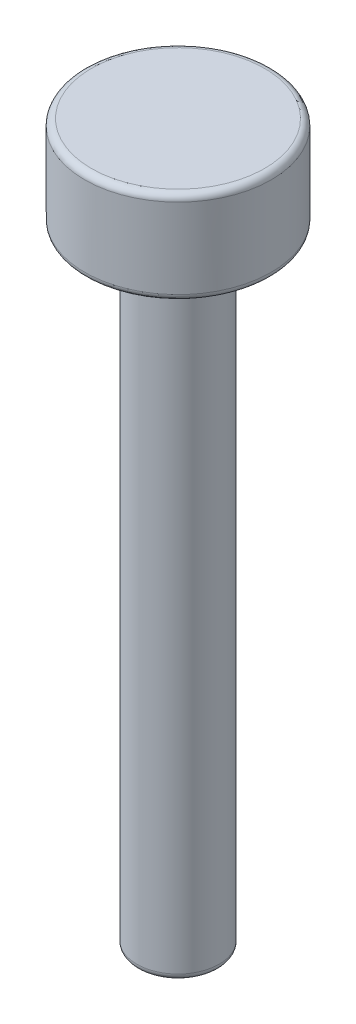
ISO-10303-21;
HEADER;
FILE_DESCRIPTION(('STEP AP214'),'2;1');
FILE_NAME('part.step','',(''),(''),'','','');
FILE_SCHEMA(('AUTOMOTIVE_DESIGN { 1 0 10303 214 1 1 1 1 }'));
ENDSEC;
DATA;
#1=APPLICATION_CONTEXT('core data for automotive mechanical design processes');
#2=APPLICATION_PROTOCOL_DEFINITION('international standard','automotive_design',2000,#1);
#3=PRODUCT_CONTEXT('',#1,'mechanical');
#4=PRODUCT('Part','Part','',(#3));
#5=PRODUCT_RELATED_PRODUCT_CATEGORY('part','',(#4));
#6=PRODUCT_DEFINITION_FORMATION('','',#4);
#7=PRODUCT_DEFINITION_CONTEXT('part definition',#1,'design');
#8=PRODUCT_DEFINITION('design','',#6,#7);
#9=PRODUCT_DEFINITION_SHAPE('','',#8);
#10=(LENGTH_UNIT() NAMED_UNIT(*) SI_UNIT(.MILLI.,.METRE.));
#11=(NAMED_UNIT(*) PLANE_ANGLE_UNIT() SI_UNIT($,.RADIAN.));
#12=(NAMED_UNIT(*) SI_UNIT($,.STERADIAN.) SOLID_ANGLE_UNIT());
#13=UNCERTAINTY_MEASURE_WITH_UNIT(LENGTH_MEASURE(1.E-05),#10,'distance_accuracy_value','');
#14=(GEOMETRIC_REPRESENTATION_CONTEXT(3) GLOBAL_UNCERTAINTY_ASSIGNED_CONTEXT((#13)) GLOBAL_UNIT_ASSIGNED_CONTEXT((#10,
#11,#12)) REPRESENTATION_CONTEXT('',''));
#15=CARTESIAN_POINT('',(0.,0.,0.));
#16=DIRECTION('',(0.,0.,1.));
#17=DIRECTION('',(1.,0.,0.));
#18=AXIS2_PLACEMENT_3D('',#15,#16,#17);
#19=CARTESIAN_POINT('',(0.,0.,0.));
#20=DIRECTION('',(0.,-1.,0.));
#21=DIRECTION('',(0.,0.,-1.));
#22=AXIS2_PLACEMENT_3D('',#19,#20,#21);
#23=PLANE('',#22);
#24=CARTESIAN_POINT('',(0.,0.,0.));
#25=DIRECTION('',(0.,-1.,0.));
#26=DIRECTION('',(0.,0.,-1.));
#27=AXIS2_PLACEMENT_3D('',#24,#25,#26);
#28=CIRCLE('',#27,4.0005);
#29=CARTESIAN_POINT('',(0.,0.,-4.0005));
#30=VERTEX_POINT('',#29);
#31=EDGE_CURVE('E49',#30,#30,#28,.T.);
#32=ORIENTED_EDGE('',*,*,#31,.T.);
#33=EDGE_LOOP('',(#32));
#34=FACE_BOUND('',#33,.T.);
#35=ADVANCED_FACE('F41',(#34),#23,.T.);
#36=CARTESIAN_POINT('',(0.,0.,0.));
#37=DIRECTION('',(0.,-1.,0.));
#38=DIRECTION('',(0.,0.,-1.));
#39=AXIS2_PLACEMENT_3D('',#36,#37,#38);
#40=CYLINDRICAL_SURFACE('',#39,4.7625);
#41=CARTESIAN_POINT('',(0.,0.762,0.));
#42=DIRECTION('',(0.,-1.,0.));
#43=DIRECTION('',(0.,0.,-1.));
#44=AXIS2_PLACEMENT_3D('',#41,#42,#43);
#45=CIRCLE('',#44,4.7625);
#46=CARTESIAN_POINT('',(0.,0.762,-4.7625));
#47=VERTEX_POINT('',#46);
#48=EDGE_CURVE('E10',#47,#47,#45,.F.);
#49=ORIENTED_EDGE('',*,*,#48,.T.);
#50=EDGE_LOOP('',(#49));
#51=FACE_BOUND('',#50,.T.);
#52=CARTESIAN_POINT('',(0.,72.39,0.));
#53=DIRECTION('',(0.,-1.,0.));
#54=DIRECTION('',(0.,0.,-1.));
#55=AXIS2_PLACEMENT_3D('',#52,#53,#54);
#56=CIRCLE('',#55,4.7625);
#57=CARTESIAN_POINT('',(0.,72.39,-4.7625));
#58=VERTEX_POINT('',#57);
#59=EDGE_CURVE('E73',#58,#58,#56,.T.);
#60=ORIENTED_EDGE('',*,*,#59,.T.);
#61=EDGE_LOOP('',(#60));
#62=FACE_BOUND('',#61,.T.);
#63=ADVANCED_FACE('F78',(#51,#62),#40,.T.);
#64=CARTESIAN_POINT('',(4.7625,72.39,0.));
#65=DIRECTION('',(0.,-1.,0.));
#66=DIRECTION('',(0.,0.,-1.));
#67=AXIS2_PLACEMENT_3D('',#64,#65,#66);
#68=PLANE('',#67);
#69=CARTESIAN_POINT('',(0.,72.39,0.));
#70=DIRECTION('',(0.,-1.,0.));
#71=DIRECTION('',(0.,0.,-1.));
#72=AXIS2_PLACEMENT_3D('',#69,#70,#71);
#73=CIRCLE('',#72,10.033);
#74=CARTESIAN_POINT('',(0.,72.39,-10.033));
#75=VERTEX_POINT('',#74);
#76=EDGE_CURVE('E69',#75,#75,#73,.T.);
#77=ORIENTED_EDGE('',*,*,#76,.T.);
#78=EDGE_LOOP('',(#77));
#79=FACE_BOUND('',#78,.T.);
#80=ORIENTED_EDGE('',*,*,#59,.F.);
#81=EDGE_LOOP('',(#80));
#82=FACE_BOUND('',#81,.T.);
#83=ADVANCED_FACE('F80',(#79,#82),#68,.T.);
#84=CARTESIAN_POINT('',(0.,0.,0.));
#85=DIRECTION('',(0.,-1.,0.));
#86=DIRECTION('',(0.,0.,-1.));
#87=AXIS2_PLACEMENT_3D('',#84,#85,#86);
#88=CYLINDRICAL_SURFACE('',#87,10.795);
#89=CARTESIAN_POINT('',(0.,73.152,0.));
#90=DIRECTION('',(0.,-1.,0.));
#91=DIRECTION('',(0.,0.,-1.));
#92=AXIS2_PLACEMENT_3D('',#89,#90,#91);
#93=CIRCLE('',#92,10.795);
#94=CARTESIAN_POINT('',(0.,73.152,-10.795));
#95=VERTEX_POINT('',#94);
#96=EDGE_CURVE('E59',#95,#95,#93,.F.);
#97=ORIENTED_EDGE('',*,*,#96,.T.);
#98=EDGE_LOOP('',(#97));
#99=FACE_BOUND('',#98,.T.);
#100=CARTESIAN_POINT('',(0.,82.423,0.));
#101=DIRECTION('',(0.,1.,0.));
#102=DIRECTION('',(0.,0.,1.));
#103=AXIS2_PLACEMENT_3D('',#100,#101,#102);
#104=CIRCLE('',#103,10.795);
#105=CARTESIAN_POINT('',(0.,82.423,10.795));
#106=VERTEX_POINT('',#105);
#107=EDGE_CURVE('E65',#106,#106,#104,.F.);
#108=ORIENTED_EDGE('',*,*,#107,.T.);
#109=EDGE_LOOP('',(#108));
#110=FACE_BOUND('',#109,.T.);
#111=ADVANCED_FACE('F82',(#99,#110),#88,.T.);
#112=CARTESIAN_POINT('',(10.795,83.185,0.));
#113=DIRECTION('',(0.,1.,0.));
#114=DIRECTION('',(0.,0.,1.));
#115=AXIS2_PLACEMENT_3D('',#112,#113,#114);
#116=PLANE('',#115);
#117=CARTESIAN_POINT('',(0.,83.185,0.));
#118=DIRECTION('',(0.,1.,0.));
#119=DIRECTION('',(0.,0.,1.));
#120=AXIS2_PLACEMENT_3D('',#117,#118,#119);
#121=CIRCLE('',#120,10.033);
#122=CARTESIAN_POINT('',(0.,83.185,10.033));
#123=VERTEX_POINT('',#122);
#124=EDGE_CURVE('E54',#123,#123,#121,.T.);
#125=ORIENTED_EDGE('',*,*,#124,.T.);
#126=EDGE_LOOP('',(#125));
#127=FACE_BOUND('',#126,.T.);
#128=ADVANCED_FACE('F89',(#127),#116,.T.);
#129=CARTESIAN_POINT('',(0.,73.152,0.));
#130=DIRECTION('',(0.,-1.,0.));
#131=DIRECTION('',(0.,0.,-1.));
#132=AXIS2_PLACEMENT_3D('',#129,#130,#131);
#133=TOROIDAL_SURFACE('',#132,10.033,0.762);
#134=ORIENTED_EDGE('',*,*,#96,.F.);
#135=EDGE_LOOP('',(#134));
#136=FACE_BOUND('',#135,.T.);
#137=ORIENTED_EDGE('',*,*,#76,.F.);
#138=EDGE_LOOP('',(#137));
#139=FACE_BOUND('',#138,.T.);
#140=ADVANCED_FACE('F98',(#136,#139),#133,.T.);
#141=CARTESIAN_POINT('',(0.,82.423,0.));
#142=DIRECTION('',(0.,1.,0.));
#143=DIRECTION('',(0.,0.,1.));
#144=AXIS2_PLACEMENT_3D('',#141,#142,#143);
#145=TOROIDAL_SURFACE('',#144,10.033,0.762);
#146=ORIENTED_EDGE('',*,*,#124,.F.);
#147=EDGE_LOOP('',(#146));
#148=FACE_BOUND('',#147,.T.);
#149=ORIENTED_EDGE('',*,*,#107,.F.);
#150=EDGE_LOOP('',(#149));
#151=FACE_BOUND('',#150,.T.);
#152=ADVANCED_FACE('F100',(#148,#151),#145,.T.);
#153=CARTESIAN_POINT('',(0.,0.762,0.));
#154=DIRECTION('',(0.,-1.,0.));
#155=DIRECTION('',(0.,0.,-1.));
#156=AXIS2_PLACEMENT_3D('',#153,#154,#155);
#157=TOROIDAL_SURFACE('',#156,4.0005,0.762);
#158=ORIENTED_EDGE('',*,*,#48,.F.);
#159=EDGE_LOOP('',(#158));
#160=FACE_BOUND('',#159,.T.);
#161=ORIENTED_EDGE('',*,*,#31,.F.);
#162=EDGE_LOOP('',(#161));
#163=FACE_BOUND('',#162,.T.);
#164=ADVANCED_FACE('F43',(#160,#163),#157,.T.);
#165=CLOSED_SHELL('',(#35,#63,#83,#111,#128,#140,#152,#164));
#166=MANIFOLD_SOLID_BREP('B2',#165);
#167=ADVANCED_BREP_SHAPE_REPRESENTATION('',(#18,#166),#14);
#168=SHAPE_DEFINITION_REPRESENTATION(#9,#167);
ENDSEC;
END-ISO-10303-21;
